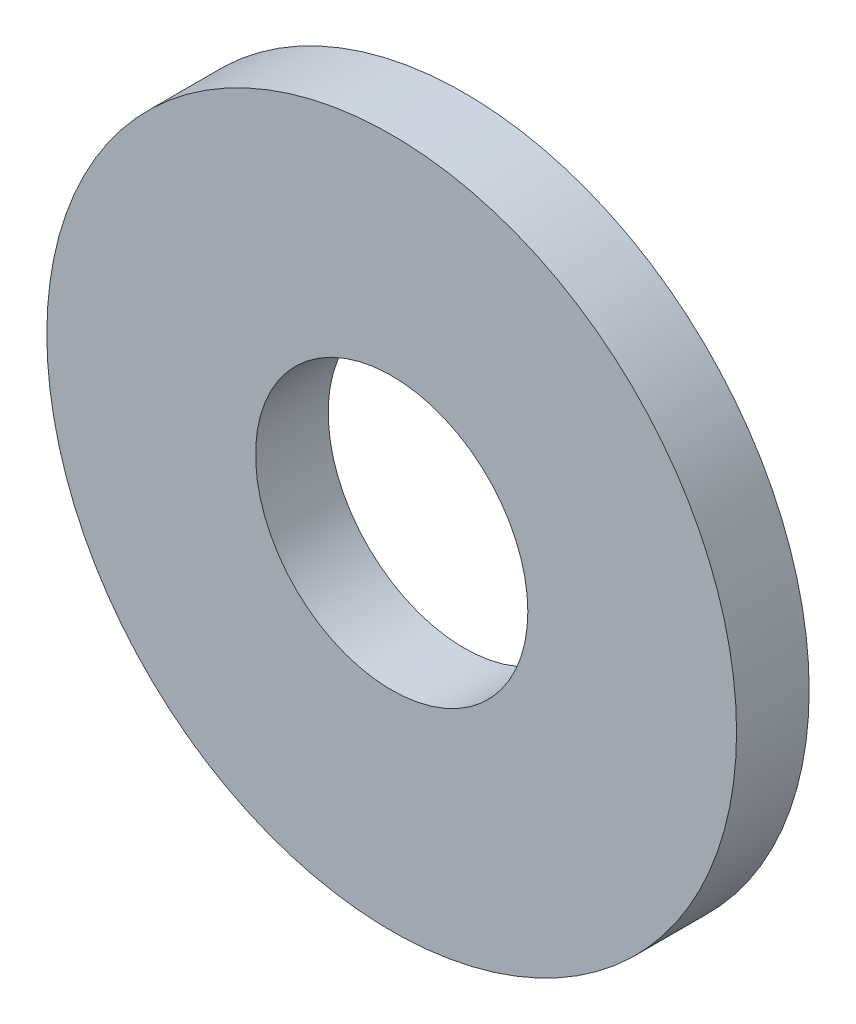
ISO-10303-21;
HEADER;
FILE_DESCRIPTION(('STEP AP214'),'2;1');
FILE_NAME('part.step','',(''),(''),'','','');
FILE_SCHEMA(('AUTOMOTIVE_DESIGN { 1 0 10303 214 1 1 1 1 }'));
ENDSEC;
DATA;
#1=APPLICATION_CONTEXT('core data for automotive mechanical design processes');
#2=APPLICATION_PROTOCOL_DEFINITION('international standard','automotive_design',2000,#1);
#3=PRODUCT_CONTEXT('',#1,'mechanical');
#4=PRODUCT('Part','Part','',(#3));
#5=PRODUCT_RELATED_PRODUCT_CATEGORY('part','',(#4));
#6=PRODUCT_DEFINITION_FORMATION('','',#4);
#7=PRODUCT_DEFINITION_CONTEXT('part definition',#1,'design');
#8=PRODUCT_DEFINITION('design','',#6,#7);
#9=PRODUCT_DEFINITION_SHAPE('','',#8);
#10=(LENGTH_UNIT() NAMED_UNIT(*) SI_UNIT(.MILLI.,.METRE.));
#11=(NAMED_UNIT(*) PLANE_ANGLE_UNIT() SI_UNIT($,.RADIAN.));
#12=(NAMED_UNIT(*) SI_UNIT($,.STERADIAN.) SOLID_ANGLE_UNIT());
#13=UNCERTAINTY_MEASURE_WITH_UNIT(LENGTH_MEASURE(1.E-05),#10,'distance_accuracy_value','');
#14=(GEOMETRIC_REPRESENTATION_CONTEXT(3) GLOBAL_UNCERTAINTY_ASSIGNED_CONTEXT((#13)) GLOBAL_UNIT_ASSIGNED_CONTEXT((#10,
#11,#12)) REPRESENTATION_CONTEXT('',''));
#15=CARTESIAN_POINT('',(0.,0.,0.));
#16=DIRECTION('',(0.,0.,1.));
#17=DIRECTION('',(1.,0.,0.));
#18=AXIS2_PLACEMENT_3D('',#15,#16,#17);
#19=CARTESIAN_POINT('',(0.,0.,0.508));
#20=DIRECTION('',(0.,0.,1.));
#21=DIRECTION('',(1.,0.,0.));
#22=AXIS2_PLACEMENT_3D('',#19,#20,#21);
#23=PLANE('',#22);
#24=CARTESIAN_POINT('',(0.,0.,0.508));
#25=DIRECTION('',(0.,0.,1.));
#26=DIRECTION('',(1.,0.,0.));
#27=AXIS2_PLACEMENT_3D('',#24,#25,#26);
#28=CIRCLE('',#27,4.826);
#29=CARTESIAN_POINT('',(4.826,0.,0.508));
#30=VERTEX_POINT('',#29);
#31=EDGE_CURVE('E10',#30,#30,#28,.T.);
#32=ORIENTED_EDGE('',*,*,#31,.T.);
#33=EDGE_LOOP('',(#32));
#34=FACE_BOUND('',#33,.T.);
#35=CARTESIAN_POINT('',(0.,0.,0.508));
#36=DIRECTION('',(0.,0.,1.));
#37=DIRECTION('',(1.,0.,0.));
#38=AXIS2_PLACEMENT_3D('',#35,#36,#37);
#39=CIRCLE('',#38,1.905);
#40=CARTESIAN_POINT('',(1.905,0.,0.508));
#41=VERTEX_POINT('',#40);
#42=EDGE_CURVE('E37',#41,#41,#39,.T.);
#43=ORIENTED_EDGE('',*,*,#42,.F.);
#44=EDGE_LOOP('',(#43));
#45=FACE_BOUND('',#44,.T.);
#46=ADVANCED_FACE('F30',(#34,#45),#23,.T.);
#47=CARTESIAN_POINT('',(0.,0.,0.508));
#48=DIRECTION('',(0.,0.,-1.));
#49=DIRECTION('',(-1.,0.,0.));
#50=AXIS2_PLACEMENT_3D('',#47,#48,#49);
#51=CYLINDRICAL_SURFACE('',#50,4.826);
#52=ORIENTED_EDGE('',*,*,#31,.F.);
#53=EDGE_LOOP('',(#52));
#54=FACE_BOUND('',#53,.T.);
#55=CARTESIAN_POINT('',(0.,0.,-0.508));
#56=DIRECTION('',(0.,0.,1.));
#57=DIRECTION('',(1.,0.,0.));
#58=AXIS2_PLACEMENT_3D('',#55,#56,#57);
#59=CIRCLE('',#58,4.826);
#60=CARTESIAN_POINT('',(4.826,0.,-0.508));
#61=VERTEX_POINT('',#60);
#62=EDGE_CURVE('E41',#61,#61,#59,.T.);
#63=ORIENTED_EDGE('',*,*,#62,.T.);
#64=EDGE_LOOP('',(#63));
#65=FACE_BOUND('',#64,.T.);
#66=ADVANCED_FACE('F32',(#54,#65),#51,.T.);
#67=CARTESIAN_POINT('',(0.,0.,0.508));
#68=DIRECTION('',(0.,0.,-1.));
#69=DIRECTION('',(-1.,0.,0.));
#70=AXIS2_PLACEMENT_3D('',#67,#68,#69);
#71=CYLINDRICAL_SURFACE('',#70,1.905);
#72=ORIENTED_EDGE('',*,*,#42,.T.);
#73=EDGE_LOOP('',(#72));
#74=FACE_BOUND('',#73,.T.);
#75=CARTESIAN_POINT('',(0.,0.,-0.508));
#76=DIRECTION('',(0.,0.,1.));
#77=DIRECTION('',(1.,0.,0.));
#78=AXIS2_PLACEMENT_3D('',#75,#76,#77);
#79=CIRCLE('',#78,1.905);
#80=CARTESIAN_POINT('',(1.905,0.,-0.508));
#81=VERTEX_POINT('',#80);
#82=EDGE_CURVE('E45',#81,#81,#79,.T.);
#83=ORIENTED_EDGE('',*,*,#82,.F.);
#84=EDGE_LOOP('',(#83));
#85=FACE_BOUND('',#84,.T.);
#86=ADVANCED_FACE('F54',(#74,#85),#71,.F.);
#87=CARTESIAN_POINT('',(0.,0.,-0.508));
#88=DIRECTION('',(0.,0.,1.));
#89=DIRECTION('',(1.,0.,0.));
#90=AXIS2_PLACEMENT_3D('',#87,#88,#89);
#91=PLANE('',#90);
#92=ORIENTED_EDGE('',*,*,#82,.T.);
#93=EDGE_LOOP('',(#92));
#94=FACE_BOUND('',#93,.T.);
#95=ORIENTED_EDGE('',*,*,#62,.F.);
#96=EDGE_LOOP('',(#95));
#97=FACE_BOUND('',#96,.T.);
#98=ADVANCED_FACE('F51',(#94,#97),#91,.F.);
#99=CLOSED_SHELL('',(#46,#66,#86,#98));
#100=MANIFOLD_SOLID_BREP('B2',#99);
#101=ADVANCED_BREP_SHAPE_REPRESENTATION('',(#18,#100),#14);
#102=SHAPE_DEFINITION_REPRESENTATION(#9,#101);
ENDSEC;
END-ISO-10303-21;
